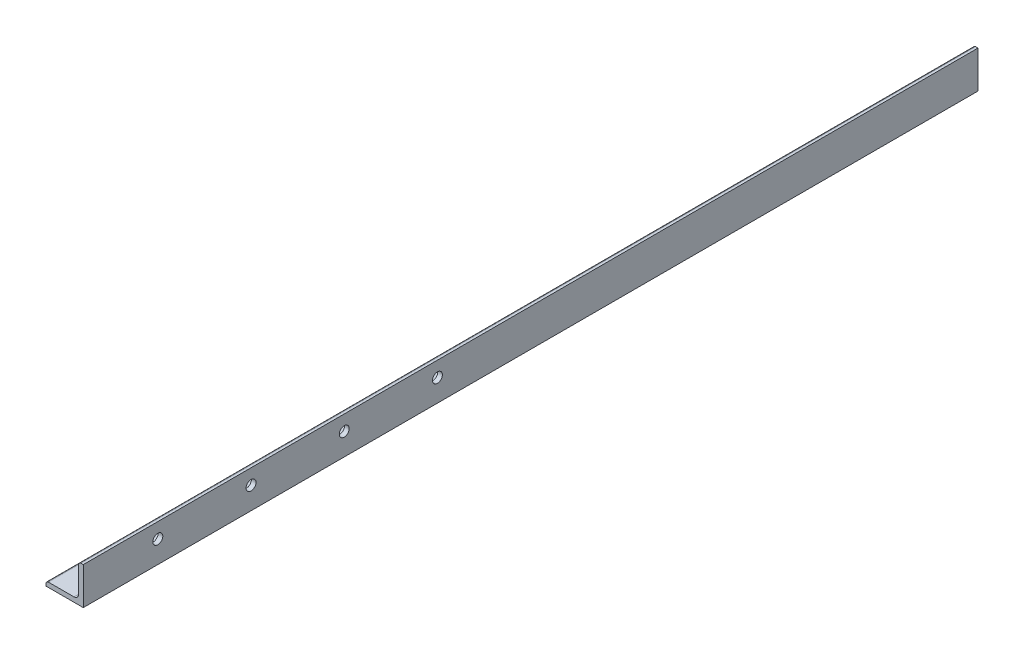
ISO-10303-21;
HEADER;
FILE_DESCRIPTION(('STEP AP214'),'2;1');
FILE_NAME('part.step','',(''),(''),'','','');
FILE_SCHEMA(('AUTOMOTIVE_DESIGN { 1 0 10303 214 1 1 1 1 }'));
ENDSEC;
DATA;
#1=APPLICATION_CONTEXT('core data for automotive mechanical design processes');
#2=APPLICATION_PROTOCOL_DEFINITION('international standard','automotive_design',2000,#1);
#3=PRODUCT_CONTEXT('',#1,'mechanical');
#4=PRODUCT('Part','Part','',(#3));
#5=PRODUCT_RELATED_PRODUCT_CATEGORY('part','',(#4));
#6=PRODUCT_DEFINITION_FORMATION('','',#4);
#7=PRODUCT_DEFINITION_CONTEXT('part definition',#1,'design');
#8=PRODUCT_DEFINITION('design','',#6,#7);
#9=PRODUCT_DEFINITION_SHAPE('','',#8);
#10=(LENGTH_UNIT() NAMED_UNIT(*) SI_UNIT(.MILLI.,.METRE.));
#11=(NAMED_UNIT(*) PLANE_ANGLE_UNIT() SI_UNIT($,.RADIAN.));
#12=(NAMED_UNIT(*) SI_UNIT($,.STERADIAN.) SOLID_ANGLE_UNIT());
#13=UNCERTAINTY_MEASURE_WITH_UNIT(LENGTH_MEASURE(1.E-05),#10,'distance_accuracy_value','');
#14=(GEOMETRIC_REPRESENTATION_CONTEXT(3) GLOBAL_UNCERTAINTY_ASSIGNED_CONTEXT((#13)) GLOBAL_UNIT_ASSIGNED_CONTEXT((#10,
#11,#12)) REPRESENTATION_CONTEXT('',''));
#15=CARTESIAN_POINT('',(0.,0.,0.));
#16=DIRECTION('',(0.,0.,1.));
#17=DIRECTION('',(1.,0.,0.));
#18=AXIS2_PLACEMENT_3D('',#15,#16,#17);
#19=CARTESIAN_POINT('',(-12.7,-11.1125,304.8));
#20=DIRECTION('',(1.,0.,0.));
#21=DIRECTION('',(0.,0.,-1.));
#22=AXIS2_PLACEMENT_3D('',#19,#20,#21);
#23=PLANE('',#22);
#24=DIRECTION('',(0.,-1.,0.));
#25=VECTOR('',#24,1.);
#26=CARTESIAN_POINT('',(-12.7,-11.1125,-304.8));
#27=LINE('',#26,#25);
#28=CARTESIAN_POINT('',(-12.7,-11.1125,-304.8));
#29=VERTEX_POINT('',#28);
#30=CARTESIAN_POINT('',(-12.7,-12.7,-304.8));
#31=VERTEX_POINT('',#30);
#32=EDGE_CURVE('E141',#29,#31,#27,.T.);
#33=ORIENTED_EDGE('',*,*,#32,.T.);
#34=DIRECTION('',(0.,0.,-1.));
#35=VECTOR('',#34,1.);
#36=CARTESIAN_POINT('',(-12.7,-12.7,304.8));
#37=LINE('',#36,#35);
#38=CARTESIAN_POINT('',(-12.7,-12.7,304.8));
#39=VERTEX_POINT('',#38);
#40=EDGE_CURVE('E11',#39,#31,#37,.T.);
#41=ORIENTED_EDGE('',*,*,#40,.F.);
#42=DIRECTION('',(0.,-1.,0.));
#43=VECTOR('',#42,1.);
#44=CARTESIAN_POINT('',(-12.7,-11.1125,304.8));
#45=LINE('',#44,#43);
#46=CARTESIAN_POINT('',(-12.7,-11.1125,304.8));
#47=VERTEX_POINT('',#46);
#48=EDGE_CURVE('E158',#47,#39,#45,.T.);
#49=ORIENTED_EDGE('',*,*,#48,.F.);
#50=DIRECTION('',(0.,0.,-1.));
#51=VECTOR('',#50,1.);
#52=CARTESIAN_POINT('',(-12.7,-11.1125,304.8));
#53=LINE('',#52,#51);
#54=EDGE_CURVE('E137',#47,#29,#53,.T.);
#55=ORIENTED_EDGE('',*,*,#54,.T.);
#56=EDGE_LOOP('',(#33,#41,#49,#55));
#57=FACE_BOUND('',#56,.T.);
#58=ADVANCED_FACE('F39',(#57),#23,.F.);
#59=CARTESIAN_POINT('',(-12.7,-12.7,304.8));
#60=DIRECTION('',(0.,1.,0.));
#61=DIRECTION('',(-1.,0.,0.));
#62=AXIS2_PLACEMENT_3D('',#59,#60,#61);
#63=PLANE('',#62);
#64=CARTESIAN_POINT('',(-2.38125,-12.7,-279.4));
#65=DIRECTION('',(0.,1.,0.));
#66=DIRECTION('',(0.,0.,1.));
#67=AXIS2_PLACEMENT_3D('',#64,#65,#66);
#68=CIRCLE('',#67,4.2164);
#69=CARTESIAN_POINT('',(-2.38125,-12.7,-275.1836));
#70=VERTEX_POINT('',#69);
#71=EDGE_CURVE('E240',#70,#70,#68,.T.);
#72=ORIENTED_EDGE('',*,*,#71,.T.);
#73=EDGE_LOOP('',(#72));
#74=FACE_BOUND('',#73,.T.);
#75=CARTESIAN_POINT('',(-2.38125,-12.7,282.575));
#76=DIRECTION('',(0.,1.,0.));
#77=DIRECTION('',(0.,0.,1.));
#78=AXIS2_PLACEMENT_3D('',#75,#76,#77);
#79=CIRCLE('',#78,3.3782);
#80=CARTESIAN_POINT('',(-2.38125,-12.7,285.9532));
#81=VERTEX_POINT('',#80);
#82=EDGE_CURVE('E210',#81,#81,#79,.T.);
#83=ORIENTED_EDGE('',*,*,#82,.T.);
#84=EDGE_LOOP('',(#83));
#85=FACE_BOUND('',#84,.T.);
#86=CARTESIAN_POINT('',(-2.38125,-12.7,-228.6));
#87=DIRECTION('',(0.,1.,0.));
#88=DIRECTION('',(0.,0.,1.));
#89=AXIS2_PLACEMENT_3D('',#86,#87,#88);
#90=CIRCLE('',#89,3.3782);
#91=CARTESIAN_POINT('',(-2.38125,-12.7,-225.2218));
#92=VERTEX_POINT('',#91);
#93=EDGE_CURVE('E204',#92,#92,#90,.T.);
#94=ORIENTED_EDGE('',*,*,#93,.T.);
#95=EDGE_LOOP('',(#94));
#96=FACE_BOUND('',#95,.T.);
#97=CARTESIAN_POINT('',(-2.38125,-12.7,105.9688));
#98=DIRECTION('',(0.,1.,0.));
#99=DIRECTION('',(0.,0.,1.));
#100=AXIS2_PLACEMENT_3D('',#97,#98,#99);
#101=CIRCLE('',#100,3.3782);
#102=CARTESIAN_POINT('',(-2.38125,-12.7,109.347));
#103=VERTEX_POINT('',#102);
#104=EDGE_CURVE('E145',#103,#103,#101,.T.);
#105=ORIENTED_EDGE('',*,*,#104,.T.);
#106=EDGE_LOOP('',(#105));
#107=FACE_BOUND('',#106,.T.);
#108=DIRECTION('',(1.,0.,0.));
#109=VECTOR('',#108,1.);
#110=CARTESIAN_POINT('',(-12.7,-12.7,-304.8));
#111=LINE('',#110,#109);
#112=CARTESIAN_POINT('',(12.7,-12.7,-304.8));
#113=VERTEX_POINT('',#112);
#114=EDGE_CURVE('E144',#31,#113,#111,.T.);
#115=ORIENTED_EDGE('',*,*,#114,.T.);
#116=DIRECTION('',(0.,0.,-1.));
#117=VECTOR('',#116,1.);
#118=CARTESIAN_POINT('',(12.7,-12.7,304.8));
#119=LINE('',#118,#117);
#120=CARTESIAN_POINT('',(12.7,-12.7,304.8));
#121=VERTEX_POINT('',#120);
#122=EDGE_CURVE('E47',#121,#113,#119,.T.);
#123=ORIENTED_EDGE('',*,*,#122,.F.);
#124=DIRECTION('',(1.,0.,0.));
#125=VECTOR('',#124,1.);
#126=CARTESIAN_POINT('',(-12.7,-12.7,304.8));
#127=LINE('',#126,#125);
#128=EDGE_CURVE('E101',#39,#121,#127,.T.);
#129=ORIENTED_EDGE('',*,*,#128,.F.);
#130=ORIENTED_EDGE('',*,*,#40,.T.);
#131=EDGE_LOOP('',(#115,#123,#129,#130));
#132=FACE_BOUND('',#131,.T.);
#133=ADVANCED_FACE('F276',(#74,#85,#96,#107,#132),#63,.F.);
#134=CARTESIAN_POINT('',(12.7,-12.7,304.8));
#135=DIRECTION('',(-1.,0.,0.));
#136=DIRECTION('',(0.,-1.,0.));
#137=AXIS2_PLACEMENT_3D('',#134,#135,#136);
#138=PLANE('',#137);
#139=CARTESIAN_POINT('',(12.7,2.38125,254.));
#140=DIRECTION('',(-1.,0.,0.));
#141=DIRECTION('',(0.,0.,1.));
#142=AXIS2_PLACEMENT_3D('',#139,#140,#141);
#143=CIRCLE('',#142,3.3782);
#144=CARTESIAN_POINT('',(12.7,2.38125,257.3782));
#145=VERTEX_POINT('',#144);
#146=EDGE_CURVE('E234',#145,#145,#143,.T.);
#147=ORIENTED_EDGE('',*,*,#146,.T.);
#148=EDGE_LOOP('',(#147));
#149=FACE_BOUND('',#148,.T.);
#150=CARTESIAN_POINT('',(12.7,2.38125,190.5));
#151=DIRECTION('',(-1.,0.,0.));
#152=DIRECTION('',(0.,0.,1.));
#153=AXIS2_PLACEMENT_3D('',#150,#151,#152);
#154=CIRCLE('',#153,3.3782);
#155=CARTESIAN_POINT('',(12.7,2.38125,193.8782));
#156=VERTEX_POINT('',#155);
#157=EDGE_CURVE('E228',#156,#156,#154,.T.);
#158=ORIENTED_EDGE('',*,*,#157,.T.);
#159=EDGE_LOOP('',(#158));
#160=FACE_BOUND('',#159,.T.);
#161=CARTESIAN_POINT('',(12.7,2.38125,127.));
#162=DIRECTION('',(-1.,0.,0.));
#163=DIRECTION('',(0.,0.,1.));
#164=AXIS2_PLACEMENT_3D('',#161,#162,#163);
#165=CIRCLE('',#164,3.3782);
#166=CARTESIAN_POINT('',(12.7,2.38125,130.3782));
#167=VERTEX_POINT('',#166);
#168=EDGE_CURVE('E222',#167,#167,#165,.T.);
#169=ORIENTED_EDGE('',*,*,#168,.T.);
#170=EDGE_LOOP('',(#169));
#171=FACE_BOUND('',#170,.T.);
#172=CARTESIAN_POINT('',(12.7,2.38125,63.5));
#173=DIRECTION('',(-1.,0.,0.));
#174=DIRECTION('',(0.,0.,1.));
#175=AXIS2_PLACEMENT_3D('',#172,#173,#174);
#176=CIRCLE('',#175,3.3782);
#177=CARTESIAN_POINT('',(12.7,2.38125,66.8782));
#178=VERTEX_POINT('',#177);
#179=EDGE_CURVE('E216',#178,#178,#176,.T.);
#180=ORIENTED_EDGE('',*,*,#179,.T.);
#181=EDGE_LOOP('',(#180));
#182=FACE_BOUND('',#181,.T.);
#183=DIRECTION('',(0.,1.,0.));
#184=VECTOR('',#183,1.);
#185=CARTESIAN_POINT('',(12.7,-12.7,-304.8));
#186=LINE('',#185,#184);
#187=CARTESIAN_POINT('',(12.7,12.7,-304.8));
#188=VERTEX_POINT('',#187);
#189=EDGE_CURVE('E147',#113,#188,#186,.T.);
#190=ORIENTED_EDGE('',*,*,#189,.T.);
#191=DIRECTION('',(0.,0.,-1.));
#192=VECTOR('',#191,1.);
#193=CARTESIAN_POINT('',(12.7,12.7,304.8));
#194=LINE('',#193,#192);
#195=CARTESIAN_POINT('',(12.7,12.7,304.8));
#196=VERTEX_POINT('',#195);
#197=EDGE_CURVE('E168',#196,#188,#194,.T.);
#198=ORIENTED_EDGE('',*,*,#197,.F.);
#199=DIRECTION('',(0.,1.,0.));
#200=VECTOR('',#199,1.);
#201=CARTESIAN_POINT('',(12.7,-12.7,304.8));
#202=LINE('',#201,#200);
#203=EDGE_CURVE('E176',#121,#196,#202,.T.);
#204=ORIENTED_EDGE('',*,*,#203,.F.);
#205=ORIENTED_EDGE('',*,*,#122,.T.);
#206=EDGE_LOOP('',(#190,#198,#204,#205));
#207=FACE_BOUND('',#206,.T.);
#208=ADVANCED_FACE('F174',(#149,#160,#171,#182,#207),#138,.F.);
#209=CARTESIAN_POINT('',(11.1125,12.7,304.8));
#210=DIRECTION('',(0.,-1.,0.));
#211=DIRECTION('',(0.,0.,-1.));
#212=AXIS2_PLACEMENT_3D('',#209,#210,#211);
#213=PLANE('',#212);
#214=DIRECTION('',(-1.,0.,0.));
#215=VECTOR('',#214,1.);
#216=CARTESIAN_POINT('',(11.1125,12.7,-304.8));
#217=LINE('',#216,#215);
#218=CARTESIAN_POINT('',(11.1125,12.7,-304.8));
#219=VERTEX_POINT('',#218);
#220=EDGE_CURVE('E149',#188,#219,#217,.T.);
#221=ORIENTED_EDGE('',*,*,#220,.T.);
#222=DIRECTION('',(0.,0.,-1.));
#223=VECTOR('',#222,1.);
#224=CARTESIAN_POINT('',(11.1125,12.7,304.8));
#225=LINE('',#224,#223);
#226=CARTESIAN_POINT('',(11.1125,12.7,304.8));
#227=VERTEX_POINT('',#226);
#228=EDGE_CURVE('E165',#227,#219,#225,.T.);
#229=ORIENTED_EDGE('',*,*,#228,.F.);
#230=DIRECTION('',(-1.,0.,0.));
#231=VECTOR('',#230,1.);
#232=CARTESIAN_POINT('',(11.1125,12.7,304.8));
#233=LINE('',#232,#231);
#234=EDGE_CURVE('E192',#196,#227,#233,.T.);
#235=ORIENTED_EDGE('',*,*,#234,.F.);
#236=ORIENTED_EDGE('',*,*,#197,.T.);
#237=EDGE_LOOP('',(#221,#229,#235,#236));
#238=FACE_BOUND('',#237,.T.);
#239=ADVANCED_FACE('F185',(#238),#213,.F.);
#240=CARTESIAN_POINT('',(11.1125,11.1125,304.8));
#241=DIRECTION('',(0.,0.,-1.));
#242=DIRECTION('',(-1.,0.,0.));
#243=AXIS2_PLACEMENT_3D('',#240,#241,#242);
#244=CYLINDRICAL_SURFACE('',#243,1.5875);
#245=CARTESIAN_POINT('',(11.1125,11.1125,-304.8));
#246=DIRECTION('',(0.,0.,1.));
#247=DIRECTION('',(-1.,0.,0.));
#248=AXIS2_PLACEMENT_3D('',#245,#246,#247);
#249=CIRCLE('',#248,1.5875);
#250=CARTESIAN_POINT('',(9.525,11.1125,-304.8));
#251=VERTEX_POINT('',#250);
#252=EDGE_CURVE('E151',#219,#251,#249,.T.);
#253=ORIENTED_EDGE('',*,*,#252,.T.);
#254=DIRECTION('',(0.,0.,-1.));
#255=VECTOR('',#254,1.);
#256=CARTESIAN_POINT('',(9.525,11.1125,304.8));
#257=LINE('',#256,#255);
#258=CARTESIAN_POINT('',(9.525,11.1125,304.8));
#259=VERTEX_POINT('',#258);
#260=EDGE_CURVE('E162',#259,#251,#257,.T.);
#261=ORIENTED_EDGE('',*,*,#260,.F.);
#262=CARTESIAN_POINT('',(11.1125,11.1125,304.8));
#263=DIRECTION('',(0.,0.,1.));
#264=DIRECTION('',(-1.,0.,0.));
#265=AXIS2_PLACEMENT_3D('',#262,#263,#264);
#266=CIRCLE('',#265,1.5875);
#267=EDGE_CURVE('E191',#227,#259,#266,.T.);
#268=ORIENTED_EDGE('',*,*,#267,.F.);
#269=ORIENTED_EDGE('',*,*,#228,.T.);
#270=EDGE_LOOP('',(#253,#261,#268,#269));
#271=FACE_BOUND('',#270,.T.);
#272=ADVANCED_FACE('F189',(#271),#244,.T.);
#273=CARTESIAN_POINT('',(9.525,11.1125,304.8));
#274=DIRECTION('',(1.,0.,0.));
#275=DIRECTION('',(0.,1.,0.));
#276=AXIS2_PLACEMENT_3D('',#273,#274,#275);
#277=PLANE('',#276);
#278=CARTESIAN_POINT('',(9.525,2.38125,254.));
#279=DIRECTION('',(-1.,0.,0.));
#280=DIRECTION('',(0.,0.,1.));
#281=AXIS2_PLACEMENT_3D('',#278,#279,#280);
#282=CIRCLE('',#281,3.37819999999999);
#283=CARTESIAN_POINT('',(9.525,2.38125,257.3782));
#284=VERTEX_POINT('',#283);
#285=EDGE_CURVE('E237',#284,#284,#282,.T.);
#286=ORIENTED_EDGE('',*,*,#285,.F.);
#287=EDGE_LOOP('',(#286));
#288=FACE_BOUND('',#287,.T.);
#289=CARTESIAN_POINT('',(9.525,2.38125,190.5));
#290=DIRECTION('',(-1.,0.,0.));
#291=DIRECTION('',(0.,0.,1.));
#292=AXIS2_PLACEMENT_3D('',#289,#290,#291);
#293=CIRCLE('',#292,3.37819999999999);
#294=CARTESIAN_POINT('',(9.525,2.38125,193.8782));
#295=VERTEX_POINT('',#294);
#296=EDGE_CURVE('E231',#295,#295,#293,.T.);
#297=ORIENTED_EDGE('',*,*,#296,.F.);
#298=EDGE_LOOP('',(#297));
#299=FACE_BOUND('',#298,.T.);
#300=CARTESIAN_POINT('',(9.525,2.38125,127.));
#301=DIRECTION('',(-1.,0.,0.));
#302=DIRECTION('',(0.,0.,1.));
#303=AXIS2_PLACEMENT_3D('',#300,#301,#302);
#304=CIRCLE('',#303,3.37819999999999);
#305=CARTESIAN_POINT('',(9.525,2.38125,130.3782));
#306=VERTEX_POINT('',#305);
#307=EDGE_CURVE('E225',#306,#306,#304,.T.);
#308=ORIENTED_EDGE('',*,*,#307,.F.);
#309=EDGE_LOOP('',(#308));
#310=FACE_BOUND('',#309,.T.);
#311=CARTESIAN_POINT('',(9.525,2.38125,63.5));
#312=DIRECTION('',(-1.,0.,0.));
#313=DIRECTION('',(0.,0.,1.));
#314=AXIS2_PLACEMENT_3D('',#311,#312,#313);
#315=CIRCLE('',#314,3.37819999999999);
#316=CARTESIAN_POINT('',(9.525,2.38125,66.8782));
#317=VERTEX_POINT('',#316);
#318=EDGE_CURVE('E219',#317,#317,#315,.T.);
#319=ORIENTED_EDGE('',*,*,#318,.F.);
#320=EDGE_LOOP('',(#319));
#321=FACE_BOUND('',#320,.T.);
#322=DIRECTION('',(0.,-1.,0.));
#323=VECTOR('',#322,1.);
#324=CARTESIAN_POINT('',(9.525,11.1125,-304.8));
#325=LINE('',#324,#323);
#326=CARTESIAN_POINT('',(9.525,-6.35,-304.8));
#327=VERTEX_POINT('',#326);
#328=EDGE_CURVE('E153',#251,#327,#325,.T.);
#329=ORIENTED_EDGE('',*,*,#328,.T.);
#330=DIRECTION('',(0.,0.,-1.));
#331=VECTOR('',#330,1.);
#332=CARTESIAN_POINT('',(9.525,-6.35,304.8));
#333=LINE('',#332,#331);
#334=CARTESIAN_POINT('',(9.525,-6.35,304.8));
#335=VERTEX_POINT('',#334);
#336=EDGE_CURVE('E132',#335,#327,#333,.T.);
#337=ORIENTED_EDGE('',*,*,#336,.F.);
#338=DIRECTION('',(0.,-1.,0.));
#339=VECTOR('',#338,1.);
#340=CARTESIAN_POINT('',(9.525,11.1125,304.8));
#341=LINE('',#340,#339);
#342=EDGE_CURVE('E123',#259,#335,#341,.T.);
#343=ORIENTED_EDGE('',*,*,#342,.F.);
#344=ORIENTED_EDGE('',*,*,#260,.T.);
#345=EDGE_LOOP('',(#329,#337,#343,#344));
#346=FACE_BOUND('',#345,.T.);
#347=ADVANCED_FACE('F286',(#288,#299,#310,#321,#346),#277,.F.);
#348=CARTESIAN_POINT('',(6.35,-6.35,304.8));
#349=DIRECTION('',(0.,0.,-1.));
#350=DIRECTION('',(-1.,0.,0.));
#351=AXIS2_PLACEMENT_3D('',#348,#349,#350);
#352=CYLINDRICAL_SURFACE('',#351,3.175);
#353=CARTESIAN_POINT('',(6.35,-6.35,-304.8));
#354=DIRECTION('',(0.,0.,-1.));
#355=DIRECTION('',(-1.,0.,0.));
#356=AXIS2_PLACEMENT_3D('',#353,#354,#355);
#357=CIRCLE('',#356,3.175);
#358=CARTESIAN_POINT('',(6.35,-9.525,-304.8));
#359=VERTEX_POINT('',#358);
#360=EDGE_CURVE('E131',#327,#359,#357,.T.);
#361=ORIENTED_EDGE('',*,*,#360,.T.);
#362=DIRECTION('',(0.,0.,-1.));
#363=VECTOR('',#362,1.);
#364=CARTESIAN_POINT('',(6.35,-9.525,304.8));
#365=LINE('',#364,#363);
#366=CARTESIAN_POINT('',(6.35,-9.525,304.8));
#367=VERTEX_POINT('',#366);
#368=EDGE_CURVE('E128',#367,#359,#365,.T.);
#369=ORIENTED_EDGE('',*,*,#368,.F.);
#370=CARTESIAN_POINT('',(6.35,-6.35,304.8));
#371=DIRECTION('',(0.,0.,-1.));
#372=DIRECTION('',(-1.,0.,0.));
#373=AXIS2_PLACEMENT_3D('',#370,#371,#372);
#374=CIRCLE('',#373,3.175);
#375=EDGE_CURVE('E117',#335,#367,#374,.T.);
#376=ORIENTED_EDGE('',*,*,#375,.F.);
#377=ORIENTED_EDGE('',*,*,#336,.T.);
#378=EDGE_LOOP('',(#361,#369,#376,#377));
#379=FACE_BOUND('',#378,.T.);
#380=ADVANCED_FACE('F129',(#379),#352,.F.);
#381=CARTESIAN_POINT('',(6.35,-9.525,304.8));
#382=DIRECTION('',(0.,-1.,0.));
#383=DIRECTION('',(1.,0.,0.));
#384=AXIS2_PLACEMENT_3D('',#381,#382,#383);
#385=PLANE('',#384);
#386=CARTESIAN_POINT('',(-2.38125,-9.525,-279.4));
#387=DIRECTION('',(0.,1.,0.));
#388=DIRECTION('',(0.,0.,1.));
#389=AXIS2_PLACEMENT_3D('',#386,#387,#388);
#390=CIRCLE('',#389,4.2164);
#391=CARTESIAN_POINT('',(-2.38125,-9.525,-275.1836));
#392=VERTEX_POINT('',#391);
#393=EDGE_CURVE('E243',#392,#392,#390,.T.);
#394=ORIENTED_EDGE('',*,*,#393,.F.);
#395=EDGE_LOOP('',(#394));
#396=FACE_BOUND('',#395,.T.);
#397=CARTESIAN_POINT('',(-2.38125,-9.525,282.575));
#398=DIRECTION('',(0.,1.,0.));
#399=DIRECTION('',(0.,0.,1.));
#400=AXIS2_PLACEMENT_3D('',#397,#398,#399);
#401=CIRCLE('',#400,3.37819999999999);
#402=CARTESIAN_POINT('',(-2.38125,-9.525,285.9532));
#403=VERTEX_POINT('',#402);
#404=EDGE_CURVE('E213',#403,#403,#401,.T.);
#405=ORIENTED_EDGE('',*,*,#404,.F.);
#406=EDGE_LOOP('',(#405));
#407=FACE_BOUND('',#406,.T.);
#408=CARTESIAN_POINT('',(-2.38125,-9.525,-228.6));
#409=DIRECTION('',(0.,1.,0.));
#410=DIRECTION('',(0.,0.,1.));
#411=AXIS2_PLACEMENT_3D('',#408,#409,#410);
#412=CIRCLE('',#411,3.37819999999999);
#413=CARTESIAN_POINT('',(-2.38125,-9.525,-225.2218));
#414=VERTEX_POINT('',#413);
#415=EDGE_CURVE('E207',#414,#414,#412,.T.);
#416=ORIENTED_EDGE('',*,*,#415,.F.);
#417=EDGE_LOOP('',(#416));
#418=FACE_BOUND('',#417,.T.);
#419=CARTESIAN_POINT('',(-2.38125,-9.525,105.9688));
#420=DIRECTION('',(0.,1.,0.));
#421=DIRECTION('',(0.,0.,1.));
#422=AXIS2_PLACEMENT_3D('',#419,#420,#421);
#423=CIRCLE('',#422,3.37819999999999);
#424=CARTESIAN_POINT('',(-2.38125,-9.525,109.347));
#425=VERTEX_POINT('',#424);
#426=EDGE_CURVE('E201',#425,#425,#423,.T.);
#427=ORIENTED_EDGE('',*,*,#426,.F.);
#428=EDGE_LOOP('',(#427));
#429=FACE_BOUND('',#428,.T.);
#430=DIRECTION('',(-1.,0.,0.));
#431=VECTOR('',#430,1.);
#432=CARTESIAN_POINT('',(6.35,-9.525,-304.8));
#433=LINE('',#432,#431);
#434=CARTESIAN_POINT('',(-11.1125,-9.525,-304.8));
#435=VERTEX_POINT('',#434);
#436=EDGE_CURVE('E87',#359,#435,#433,.T.);
#437=ORIENTED_EDGE('',*,*,#436,.T.);
#438=DIRECTION('',(0.,0.,-1.));
#439=VECTOR('',#438,1.);
#440=CARTESIAN_POINT('',(-11.1125,-9.525,304.8));
#441=LINE('',#440,#439);
#442=CARTESIAN_POINT('',(-11.1125,-9.525,304.8));
#443=VERTEX_POINT('',#442);
#444=EDGE_CURVE('E133',#443,#435,#441,.T.);
#445=ORIENTED_EDGE('',*,*,#444,.F.);
#446=DIRECTION('',(-1.,0.,0.));
#447=VECTOR('',#446,1.);
#448=CARTESIAN_POINT('',(6.35,-9.525,304.8));
#449=LINE('',#448,#447);
#450=EDGE_CURVE('E121',#367,#443,#449,.T.);
#451=ORIENTED_EDGE('',*,*,#450,.F.);
#452=ORIENTED_EDGE('',*,*,#368,.T.);
#453=EDGE_LOOP('',(#437,#445,#451,#452));
#454=FACE_BOUND('',#453,.T.);
#455=ADVANCED_FACE('F135',(#396,#407,#418,#429,#454),#385,.F.);
#456=CARTESIAN_POINT('',(-11.1125,-11.1125,304.8));
#457=DIRECTION('',(0.,0.,-1.));
#458=DIRECTION('',(-1.,0.,0.));
#459=AXIS2_PLACEMENT_3D('',#456,#457,#458);
#460=CYLINDRICAL_SURFACE('',#459,1.5875);
#461=CARTESIAN_POINT('',(-11.1125,-11.1125,-304.8));
#462=DIRECTION('',(0.,0.,1.));
#463=DIRECTION('',(-1.,0.,0.));
#464=AXIS2_PLACEMENT_3D('',#461,#462,#463);
#465=CIRCLE('',#464,1.5875);
#466=EDGE_CURVE('E93',#435,#29,#465,.T.);
#467=ORIENTED_EDGE('',*,*,#466,.T.);
#468=ORIENTED_EDGE('',*,*,#54,.F.);
#469=CARTESIAN_POINT('',(-11.1125,-11.1125,304.8));
#470=DIRECTION('',(0.,0.,1.));
#471=DIRECTION('',(-1.,0.,0.));
#472=AXIS2_PLACEMENT_3D('',#469,#470,#471);
#473=CIRCLE('',#472,1.5875);
#474=EDGE_CURVE('E55',#443,#47,#473,.T.);
#475=ORIENTED_EDGE('',*,*,#474,.F.);
#476=ORIENTED_EDGE('',*,*,#444,.T.);
#477=EDGE_LOOP('',(#467,#468,#475,#476));
#478=FACE_BOUND('',#477,.T.);
#479=ADVANCED_FACE('F251',(#478),#460,.T.);
#480=CARTESIAN_POINT('',(11.1125,11.1125,304.8));
#481=DIRECTION('',(0.,0.,-1.));
#482=DIRECTION('',(-1.,0.,0.));
#483=AXIS2_PLACEMENT_3D('',#480,#481,#482);
#484=PLANE('',#483);
#485=ORIENTED_EDGE('',*,*,#48,.T.);
#486=ORIENTED_EDGE('',*,*,#128,.T.);
#487=ORIENTED_EDGE('',*,*,#203,.T.);
#488=ORIENTED_EDGE('',*,*,#234,.T.);
#489=ORIENTED_EDGE('',*,*,#267,.T.);
#490=ORIENTED_EDGE('',*,*,#342,.T.);
#491=ORIENTED_EDGE('',*,*,#375,.T.);
#492=ORIENTED_EDGE('',*,*,#450,.T.);
#493=ORIENTED_EDGE('',*,*,#474,.T.);
#494=EDGE_LOOP('',(#485,#486,#487,#488,#489,#490,#491,#492,#493));
#495=FACE_BOUND('',#494,.T.);
#496=ADVANCED_FACE('F119',(#495),#484,.F.);
#497=CARTESIAN_POINT('',(11.1125,11.1125,-304.8));
#498=DIRECTION('',(0.,0.,-1.));
#499=DIRECTION('',(-1.,0.,0.));
#500=AXIS2_PLACEMENT_3D('',#497,#498,#499);
#501=PLANE('',#500);
#502=ORIENTED_EDGE('',*,*,#32,.F.);
#503=ORIENTED_EDGE('',*,*,#466,.F.);
#504=ORIENTED_EDGE('',*,*,#436,.F.);
#505=ORIENTED_EDGE('',*,*,#360,.F.);
#506=ORIENTED_EDGE('',*,*,#328,.F.);
#507=ORIENTED_EDGE('',*,*,#252,.F.);
#508=ORIENTED_EDGE('',*,*,#220,.F.);
#509=ORIENTED_EDGE('',*,*,#189,.F.);
#510=ORIENTED_EDGE('',*,*,#114,.F.);
#511=EDGE_LOOP('',(#502,#503,#504,#505,#506,#507,#508,#509,#510));
#512=FACE_BOUND('',#511,.T.);
#513=ADVANCED_FACE('F180',(#512),#501,.T.);
#514=CARTESIAN_POINT('',(-2.38125,-9.525,105.9688));
#515=DIRECTION('',(0.,1.,0.));
#516=DIRECTION('',(0.,0.,1.));
#517=AXIS2_PLACEMENT_3D('',#514,#515,#516);
#518=CYLINDRICAL_SURFACE('',#517,3.37819999999999);
#519=ORIENTED_EDGE('',*,*,#104,.F.);
#520=EDGE_LOOP('',(#519));
#521=FACE_BOUND('',#520,.T.);
#522=ORIENTED_EDGE('',*,*,#426,.T.);
#523=EDGE_LOOP('',(#522));
#524=FACE_BOUND('',#523,.T.);
#525=ADVANCED_FACE('F259',(#521,#524),#518,.F.);
#526=CARTESIAN_POINT('',(-2.38125,-9.525,-228.6));
#527=DIRECTION('',(0.,1.,0.));
#528=DIRECTION('',(0.,0.,1.));
#529=AXIS2_PLACEMENT_3D('',#526,#527,#528);
#530=CYLINDRICAL_SURFACE('',#529,3.37819999999999);
#531=ORIENTED_EDGE('',*,*,#93,.F.);
#532=EDGE_LOOP('',(#531));
#533=FACE_BOUND('',#532,.T.);
#534=ORIENTED_EDGE('',*,*,#415,.T.);
#535=EDGE_LOOP('',(#534));
#536=FACE_BOUND('',#535,.T.);
#537=ADVANCED_FACE('F261',(#533,#536),#530,.F.);
#538=CARTESIAN_POINT('',(-2.38125,-9.525,282.575));
#539=DIRECTION('',(0.,1.,0.));
#540=DIRECTION('',(0.,0.,1.));
#541=AXIS2_PLACEMENT_3D('',#538,#539,#540);
#542=CYLINDRICAL_SURFACE('',#541,3.37819999999999);
#543=ORIENTED_EDGE('',*,*,#82,.F.);
#544=EDGE_LOOP('',(#543));
#545=FACE_BOUND('',#544,.T.);
#546=ORIENTED_EDGE('',*,*,#404,.T.);
#547=EDGE_LOOP('',(#546));
#548=FACE_BOUND('',#547,.T.);
#549=ADVANCED_FACE('F268',(#545,#548),#542,.F.);
#550=CARTESIAN_POINT('',(9.525,2.38125,63.5));
#551=DIRECTION('',(-1.,0.,0.));
#552=DIRECTION('',(0.,0.,1.));
#553=AXIS2_PLACEMENT_3D('',#550,#551,#552);
#554=CYLINDRICAL_SURFACE('',#553,3.37819999999999);
#555=ORIENTED_EDGE('',*,*,#179,.F.);
#556=EDGE_LOOP('',(#555));
#557=FACE_BOUND('',#556,.T.);
#558=ORIENTED_EDGE('',*,*,#318,.T.);
#559=EDGE_LOOP('',(#558));
#560=FACE_BOUND('',#559,.T.);
#561=ADVANCED_FACE('F314',(#557,#560),#554,.F.);
#562=CARTESIAN_POINT('',(9.525,2.38125,127.));
#563=DIRECTION('',(-1.,0.,0.));
#564=DIRECTION('',(0.,0.,1.));
#565=AXIS2_PLACEMENT_3D('',#562,#563,#564);
#566=CYLINDRICAL_SURFACE('',#565,3.37819999999999);
#567=ORIENTED_EDGE('',*,*,#168,.F.);
#568=EDGE_LOOP('',(#567));
#569=FACE_BOUND('',#568,.T.);
#570=ORIENTED_EDGE('',*,*,#307,.T.);
#571=EDGE_LOOP('',(#570));
#572=FACE_BOUND('',#571,.T.);
#573=ADVANCED_FACE('F316',(#569,#572),#566,.F.);
#574=CARTESIAN_POINT('',(9.525,2.38125,190.5));
#575=DIRECTION('',(-1.,0.,0.));
#576=DIRECTION('',(0.,0.,1.));
#577=AXIS2_PLACEMENT_3D('',#574,#575,#576);
#578=CYLINDRICAL_SURFACE('',#577,3.37819999999999);
#579=ORIENTED_EDGE('',*,*,#157,.F.);
#580=EDGE_LOOP('',(#579));
#581=FACE_BOUND('',#580,.T.);
#582=ORIENTED_EDGE('',*,*,#296,.T.);
#583=EDGE_LOOP('',(#582));
#584=FACE_BOUND('',#583,.T.);
#585=ADVANCED_FACE('F323',(#581,#584),#578,.F.);
#586=CARTESIAN_POINT('',(9.525,2.38125,254.));
#587=DIRECTION('',(-1.,0.,0.));
#588=DIRECTION('',(0.,0.,1.));
#589=AXIS2_PLACEMENT_3D('',#586,#587,#588);
#590=CYLINDRICAL_SURFACE('',#589,3.37819999999999);
#591=ORIENTED_EDGE('',*,*,#146,.F.);
#592=EDGE_LOOP('',(#591));
#593=FACE_BOUND('',#592,.T.);
#594=ORIENTED_EDGE('',*,*,#285,.T.);
#595=EDGE_LOOP('',(#594));
#596=FACE_BOUND('',#595,.T.);
#597=ADVANCED_FACE('F331',(#593,#596),#590,.F.);
#598=CARTESIAN_POINT('',(-2.38125,-9.525,-279.4));
#599=DIRECTION('',(0.,1.,0.));
#600=DIRECTION('',(0.,0.,1.));
#601=AXIS2_PLACEMENT_3D('',#598,#599,#600);
#602=CYLINDRICAL_SURFACE('',#601,4.2164);
#603=ORIENTED_EDGE('',*,*,#71,.F.);
#604=EDGE_LOOP('',(#603));
#605=FACE_BOUND('',#604,.T.);
#606=ORIENTED_EDGE('',*,*,#393,.T.);
#607=EDGE_LOOP('',(#606));
#608=FACE_BOUND('',#607,.T.);
#609=ADVANCED_FACE('F247',(#605,#608),#602,.F.);
#610=CLOSED_SHELL('',(#58,#133,#208,#239,#272,#347,#380,#455,#479,#496,#513,#525,#537,#549,#561,
#573,#585,#597,#609));
#611=MANIFOLD_SOLID_BREP('B2',#610);
#612=ADVANCED_BREP_SHAPE_REPRESENTATION('',(#18,#611),#14);
#613=SHAPE_DEFINITION_REPRESENTATION(#9,#612);
ENDSEC;
END-ISO-10303-21;
